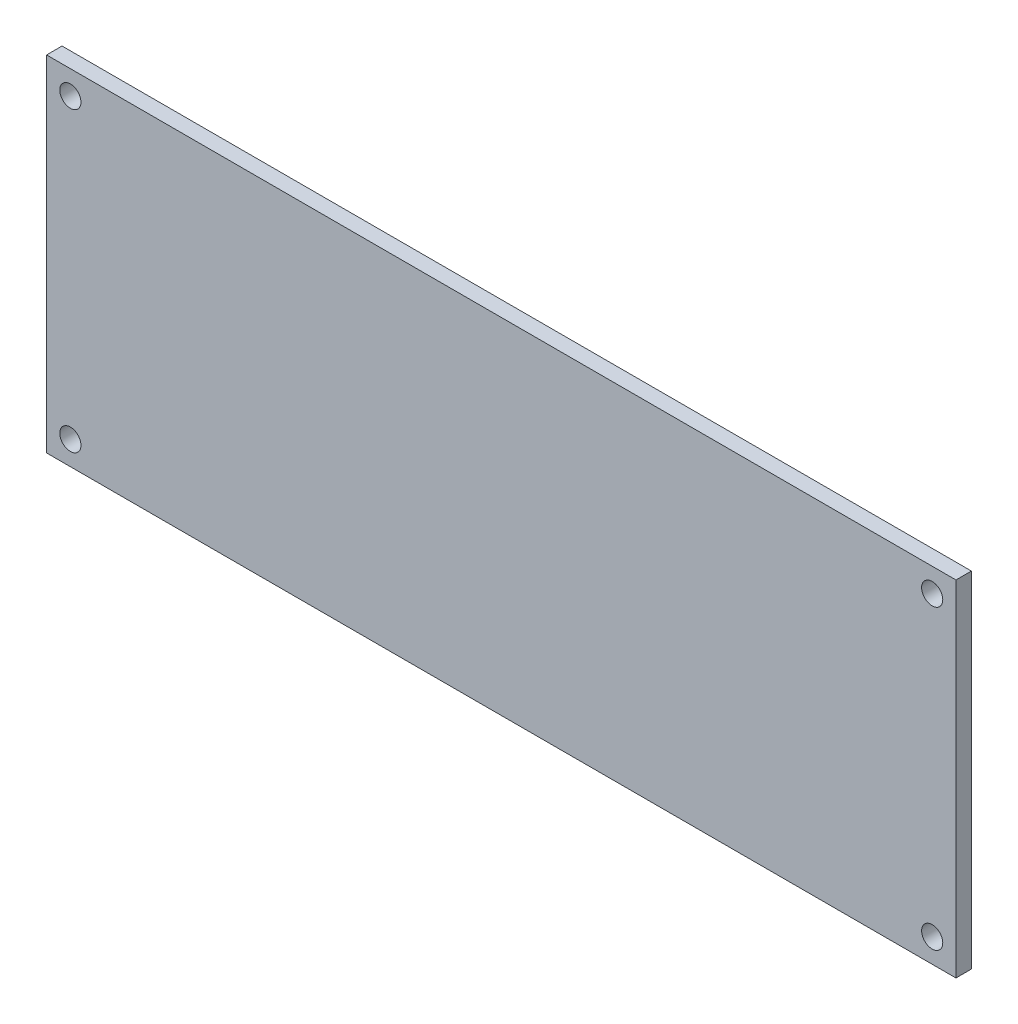
ISO-10303-21;
HEADER;
FILE_DESCRIPTION(('STEP AP214'),'2;1');
FILE_NAME('part.step','',(''),(''),'','','');
FILE_SCHEMA(('AUTOMOTIVE_DESIGN { 1 0 10303 214 1 1 1 1 }'));
ENDSEC;
DATA;
#1=APPLICATION_CONTEXT('core data for automotive mechanical design processes');
#2=APPLICATION_PROTOCOL_DEFINITION('international standard','automotive_design',2000,#1);
#3=PRODUCT_CONTEXT('',#1,'mechanical');
#4=PRODUCT('Part','Part','',(#3));
#5=PRODUCT_RELATED_PRODUCT_CATEGORY('part','',(#4));
#6=PRODUCT_DEFINITION_FORMATION('','',#4);
#7=PRODUCT_DEFINITION_CONTEXT('part definition',#1,'design');
#8=PRODUCT_DEFINITION('design','',#6,#7);
#9=PRODUCT_DEFINITION_SHAPE('','',#8);
#10=(LENGTH_UNIT() NAMED_UNIT(*) SI_UNIT(.MILLI.,.METRE.));
#11=(NAMED_UNIT(*) PLANE_ANGLE_UNIT() SI_UNIT($,.RADIAN.));
#12=(NAMED_UNIT(*) SI_UNIT($,.STERADIAN.) SOLID_ANGLE_UNIT());
#13=UNCERTAINTY_MEASURE_WITH_UNIT(LENGTH_MEASURE(1.E-05),#10,'distance_accuracy_value','');
#14=(GEOMETRIC_REPRESENTATION_CONTEXT(3) GLOBAL_UNCERTAINTY_ASSIGNED_CONTEXT((#13)) GLOBAL_UNIT_ASSIGNED_CONTEXT((#10,
#11,#12)) REPRESENTATION_CONTEXT('',''));
#15=CARTESIAN_POINT('',(0.,0.,0.));
#16=DIRECTION('',(0.,0.,1.));
#17=DIRECTION('',(1.,0.,0.));
#18=AXIS2_PLACEMENT_3D('',#15,#16,#17);
#19=CARTESIAN_POINT('',(48.5775,-18.415,1.651));
#20=DIRECTION('',(-1.,0.,0.));
#21=DIRECTION('',(0.,0.,1.));
#22=AXIS2_PLACEMENT_3D('',#19,#20,#21);
#23=PLANE('',#22);
#24=DIRECTION('',(0.,1.,0.));
#25=VECTOR('',#24,1.);
#26=CARTESIAN_POINT('',(48.5775,-18.415,0.));
#27=LINE('',#26,#25);
#28=CARTESIAN_POINT('',(48.5775,-18.415,0.));
#29=VERTEX_POINT('',#28);
#30=CARTESIAN_POINT('',(48.5775,18.415,0.));
#31=VERTEX_POINT('',#30);
#32=EDGE_CURVE('E99',#29,#31,#27,.T.);
#33=ORIENTED_EDGE('',*,*,#32,.T.);
#34=DIRECTION('',(0.,0.,-1.));
#35=VECTOR('',#34,1.);
#36=CARTESIAN_POINT('',(48.5775,18.415,1.651));
#37=LINE('',#36,#35);
#38=CARTESIAN_POINT('',(48.5775,18.415,1.651));
#39=VERTEX_POINT('',#38);
#40=EDGE_CURVE('E11',#39,#31,#37,.T.);
#41=ORIENTED_EDGE('',*,*,#40,.F.);
#42=DIRECTION('',(0.,1.,0.));
#43=VECTOR('',#42,1.);
#44=CARTESIAN_POINT('',(48.5775,-18.415,1.651));
#45=LINE('',#44,#43);
#46=CARTESIAN_POINT('',(48.5775,-18.415,1.651));
#47=VERTEX_POINT('',#46);
#48=EDGE_CURVE('E86',#47,#39,#45,.T.);
#49=ORIENTED_EDGE('',*,*,#48,.F.);
#50=DIRECTION('',(0.,0.,-1.));
#51=VECTOR('',#50,1.);
#52=CARTESIAN_POINT('',(48.5775,-18.415,1.651));
#53=LINE('',#52,#51);
#54=EDGE_CURVE('E95',#47,#29,#53,.T.);
#55=ORIENTED_EDGE('',*,*,#54,.T.);
#56=EDGE_LOOP('',(#33,#41,#49,#55));
#57=FACE_BOUND('',#56,.T.);
#58=ADVANCED_FACE('F33',(#57),#23,.F.);
#59=CARTESIAN_POINT('',(-48.5775,18.415,1.651));
#60=DIRECTION('',(0.,-1.,0.));
#61=DIRECTION('',(0.,0.,-1.));
#62=AXIS2_PLACEMENT_3D('',#59,#60,#61);
#63=PLANE('',#62);
#64=DIRECTION('',(-1.,0.,0.));
#65=VECTOR('',#64,1.);
#66=CARTESIAN_POINT('',(-48.5775,18.415,0.));
#67=LINE('',#66,#65);
#68=CARTESIAN_POINT('',(-48.5775,18.415,0.));
#69=VERTEX_POINT('',#68);
#70=EDGE_CURVE('E90',#31,#69,#67,.T.);
#71=ORIENTED_EDGE('',*,*,#70,.T.);
#72=DIRECTION('',(0.,0.,-1.));
#73=VECTOR('',#72,1.);
#74=CARTESIAN_POINT('',(-48.5775,18.415,1.651));
#75=LINE('',#74,#73);
#76=CARTESIAN_POINT('',(-48.5775,18.415,1.651));
#77=VERTEX_POINT('',#76);
#78=EDGE_CURVE('E42',#77,#69,#75,.T.);
#79=ORIENTED_EDGE('',*,*,#78,.F.);
#80=DIRECTION('',(-1.,0.,0.));
#81=VECTOR('',#80,1.);
#82=CARTESIAN_POINT('',(-48.5775,18.415,1.651));
#83=LINE('',#82,#81);
#84=EDGE_CURVE('E81',#39,#77,#83,.T.);
#85=ORIENTED_EDGE('',*,*,#84,.F.);
#86=ORIENTED_EDGE('',*,*,#40,.T.);
#87=EDGE_LOOP('',(#71,#79,#85,#86));
#88=FACE_BOUND('',#87,.T.);
#89=ADVANCED_FACE('F89',(#88),#63,.F.);
#90=CARTESIAN_POINT('',(-48.5775,-18.415,1.651));
#91=DIRECTION('',(1.,0.,0.));
#92=DIRECTION('',(0.,0.,-1.));
#93=AXIS2_PLACEMENT_3D('',#90,#91,#92);
#94=PLANE('',#93);
#95=DIRECTION('',(0.,-1.,0.));
#96=VECTOR('',#95,1.);
#97=CARTESIAN_POINT('',(-48.5775,-18.415,0.));
#98=LINE('',#97,#96);
#99=CARTESIAN_POINT('',(-48.5775,-18.415,0.));
#100=VERTEX_POINT('',#99);
#101=EDGE_CURVE('E68',#69,#100,#98,.T.);
#102=ORIENTED_EDGE('',*,*,#101,.T.);
#103=DIRECTION('',(0.,0.,-1.));
#104=VECTOR('',#103,1.);
#105=CARTESIAN_POINT('',(-48.5775,-18.415,1.651));
#106=LINE('',#105,#104);
#107=CARTESIAN_POINT('',(-48.5775,-18.415,1.651));
#108=VERTEX_POINT('',#107);
#109=EDGE_CURVE('E91',#108,#100,#106,.T.);
#110=ORIENTED_EDGE('',*,*,#109,.F.);
#111=DIRECTION('',(0.,-1.,0.));
#112=VECTOR('',#111,1.);
#113=CARTESIAN_POINT('',(-48.5775,-18.415,1.651));
#114=LINE('',#113,#112);
#115=EDGE_CURVE('E84',#77,#108,#114,.T.);
#116=ORIENTED_EDGE('',*,*,#115,.F.);
#117=ORIENTED_EDGE('',*,*,#78,.T.);
#118=EDGE_LOOP('',(#102,#110,#116,#117));
#119=FACE_BOUND('',#118,.T.);
#120=ADVANCED_FACE('F93',(#119),#94,.F.);
#121=CARTESIAN_POINT('',(-48.5775,-18.415,1.651));
#122=DIRECTION('',(0.,1.,0.));
#123=DIRECTION('',(0.,0.,1.));
#124=AXIS2_PLACEMENT_3D('',#121,#122,#123);
#125=PLANE('',#124);
#126=DIRECTION('',(1.,0.,0.));
#127=VECTOR('',#126,1.);
#128=CARTESIAN_POINT('',(-48.5775,-18.415,0.));
#129=LINE('',#128,#127);
#130=EDGE_CURVE('E74',#100,#29,#129,.T.);
#131=ORIENTED_EDGE('',*,*,#130,.T.);
#132=ORIENTED_EDGE('',*,*,#54,.F.);
#133=DIRECTION('',(1.,0.,0.));
#134=VECTOR('',#133,1.);
#135=CARTESIAN_POINT('',(-48.5775,-18.415,1.651));
#136=LINE('',#135,#134);
#137=EDGE_CURVE('E51',#108,#47,#136,.T.);
#138=ORIENTED_EDGE('',*,*,#137,.F.);
#139=ORIENTED_EDGE('',*,*,#109,.T.);
#140=EDGE_LOOP('',(#131,#132,#138,#139));
#141=FACE_BOUND('',#140,.T.);
#142=ADVANCED_FACE('F137',(#141),#125,.F.);
#143=CARTESIAN_POINT('',(0.,0.,1.651));
#144=DIRECTION('',(0.,0.,-1.));
#145=DIRECTION('',(-1.,0.,0.));
#146=AXIS2_PLACEMENT_3D('',#143,#144,#145);
#147=PLANE('',#146);
#148=CARTESIAN_POINT('',(-46.0375,15.875,1.651));
#149=DIRECTION('',(0.,0.,1.));
#150=DIRECTION('',(1.,0.,0.));
#151=AXIS2_PLACEMENT_3D('',#148,#149,#150);
#152=CIRCLE('',#151,1.13029999999999);
#153=CARTESIAN_POINT('',(-44.9072,15.875,1.651));
#154=VERTEX_POINT('',#153);
#155=EDGE_CURVE('E220',#154,#154,#152,.T.);
#156=ORIENTED_EDGE('',*,*,#155,.F.);
#157=EDGE_LOOP('',(#156));
#158=FACE_BOUND('',#157,.T.);
#159=CARTESIAN_POINT('',(-46.0375,-15.875,1.651));
#160=DIRECTION('',(0.,0.,1.));
#161=DIRECTION('',(1.,0.,0.));
#162=AXIS2_PLACEMENT_3D('',#159,#160,#161);
#163=CIRCLE('',#162,1.13029999999999);
#164=CARTESIAN_POINT('',(-44.9072,-15.875,1.651));
#165=VERTEX_POINT('',#164);
#166=EDGE_CURVE('E120',#165,#165,#163,.T.);
#167=ORIENTED_EDGE('',*,*,#166,.F.);
#168=EDGE_LOOP('',(#167));
#169=FACE_BOUND('',#168,.T.);
#170=CARTESIAN_POINT('',(46.0375,-15.875,1.651));
#171=DIRECTION('',(0.,0.,1.));
#172=DIRECTION('',(1.,0.,0.));
#173=AXIS2_PLACEMENT_3D('',#170,#171,#172);
#174=CIRCLE('',#173,1.13029999999999);
#175=CARTESIAN_POINT('',(47.1678,-15.875,1.651));
#176=VERTEX_POINT('',#175);
#177=EDGE_CURVE('E110',#176,#176,#174,.T.);
#178=ORIENTED_EDGE('',*,*,#177,.F.);
#179=EDGE_LOOP('',(#178));
#180=FACE_BOUND('',#179,.T.);
#181=CARTESIAN_POINT('',(46.0375,15.875,1.651));
#182=DIRECTION('',(0.,0.,1.));
#183=DIRECTION('',(1.,0.,0.));
#184=AXIS2_PLACEMENT_3D('',#181,#182,#183);
#185=CIRCLE('',#184,1.13029999999999);
#186=CARTESIAN_POINT('',(47.1678,15.875,1.651));
#187=VERTEX_POINT('',#186);
#188=EDGE_CURVE('E109',#187,#187,#185,.T.);
#189=ORIENTED_EDGE('',*,*,#188,.F.);
#190=EDGE_LOOP('',(#189));
#191=FACE_BOUND('',#190,.T.);
#192=ORIENTED_EDGE('',*,*,#48,.T.);
#193=ORIENTED_EDGE('',*,*,#84,.T.);
#194=ORIENTED_EDGE('',*,*,#115,.T.);
#195=ORIENTED_EDGE('',*,*,#137,.T.);
#196=EDGE_LOOP('',(#192,#193,#194,#195));
#197=FACE_BOUND('',#196,.T.);
#198=ADVANCED_FACE('F82',(#158,#169,#180,#191,#197),#147,.F.);
#199=CARTESIAN_POINT('',(0.,0.,0.));
#200=DIRECTION('',(0.,0.,-1.));
#201=DIRECTION('',(-1.,0.,0.));
#202=AXIS2_PLACEMENT_3D('',#199,#200,#201);
#203=PLANE('',#202);
#204=CARTESIAN_POINT('',(-46.0375,15.875,0.));
#205=DIRECTION('',(0.,0.,-1.));
#206=DIRECTION('',(-1.,0.,0.));
#207=AXIS2_PLACEMENT_3D('',#204,#205,#206);
#208=CIRCLE('',#207,1.13029999999999);
#209=CARTESIAN_POINT('',(-47.1678,15.875,0.));
#210=VERTEX_POINT('',#209);
#211=EDGE_CURVE('E217',#210,#210,#208,.T.);
#212=ORIENTED_EDGE('',*,*,#211,.F.);
#213=EDGE_LOOP('',(#212));
#214=FACE_BOUND('',#213,.T.);
#215=CARTESIAN_POINT('',(-46.0375,-15.875,0.));
#216=DIRECTION('',(0.,0.,-1.));
#217=DIRECTION('',(-1.,0.,0.));
#218=AXIS2_PLACEMENT_3D('',#215,#216,#217);
#219=CIRCLE('',#218,1.13029999999999);
#220=CARTESIAN_POINT('',(-47.1678,-15.875,0.));
#221=VERTEX_POINT('',#220);
#222=EDGE_CURVE('E36',#221,#221,#219,.T.);
#223=ORIENTED_EDGE('',*,*,#222,.F.);
#224=EDGE_LOOP('',(#223));
#225=FACE_BOUND('',#224,.T.);
#226=CARTESIAN_POINT('',(46.0375,-15.875,0.));
#227=DIRECTION('',(0.,0.,-1.));
#228=DIRECTION('',(-1.,0.,0.));
#229=AXIS2_PLACEMENT_3D('',#226,#227,#228);
#230=CIRCLE('',#229,1.13029999999999);
#231=CARTESIAN_POINT('',(44.9072,-15.875,0.));
#232=VERTEX_POINT('',#231);
#233=EDGE_CURVE('E107',#232,#232,#230,.T.);
#234=ORIENTED_EDGE('',*,*,#233,.F.);
#235=EDGE_LOOP('',(#234));
#236=FACE_BOUND('',#235,.T.);
#237=CARTESIAN_POINT('',(46.0375,15.875,0.));
#238=DIRECTION('',(0.,0.,-1.));
#239=DIRECTION('',(-1.,0.,0.));
#240=AXIS2_PLACEMENT_3D('',#237,#238,#239);
#241=CIRCLE('',#240,1.13029999999999);
#242=CARTESIAN_POINT('',(44.9072,15.875,0.));
#243=VERTEX_POINT('',#242);
#244=EDGE_CURVE('E102',#243,#243,#241,.T.);
#245=ORIENTED_EDGE('',*,*,#244,.F.);
#246=EDGE_LOOP('',(#245));
#247=FACE_BOUND('',#246,.T.);
#248=ORIENTED_EDGE('',*,*,#32,.F.);
#249=ORIENTED_EDGE('',*,*,#130,.F.);
#250=ORIENTED_EDGE('',*,*,#101,.F.);
#251=ORIENTED_EDGE('',*,*,#70,.F.);
#252=EDGE_LOOP('',(#248,#249,#250,#251));
#253=FACE_BOUND('',#252,.T.);
#254=ADVANCED_FACE('F130',(#214,#225,#236,#247,#253),#203,.T.);
#255=CARTESIAN_POINT('',(46.0375,15.875,1.651));
#256=DIRECTION('',(0.,0.,1.));
#257=DIRECTION('',(1.,0.,0.));
#258=AXIS2_PLACEMENT_3D('',#255,#256,#257);
#259=CYLINDRICAL_SURFACE('',#258,1.13029999999999);
#260=ORIENTED_EDGE('',*,*,#244,.T.);
#261=EDGE_LOOP('',(#260));
#262=FACE_BOUND('',#261,.T.);
#263=ORIENTED_EDGE('',*,*,#188,.T.);
#264=EDGE_LOOP('',(#263));
#265=FACE_BOUND('',#264,.T.);
#266=ADVANCED_FACE('F127',(#262,#265),#259,.F.);
#267=CARTESIAN_POINT('',(46.0375,-15.875,1.651));
#268=DIRECTION('',(0.,0.,1.));
#269=DIRECTION('',(1.,0.,0.));
#270=AXIS2_PLACEMENT_3D('',#267,#268,#269);
#271=CYLINDRICAL_SURFACE('',#270,1.13029999999999);
#272=ORIENTED_EDGE('',*,*,#233,.T.);
#273=EDGE_LOOP('',(#272));
#274=FACE_BOUND('',#273,.T.);
#275=ORIENTED_EDGE('',*,*,#177,.T.);
#276=EDGE_LOOP('',(#275));
#277=FACE_BOUND('',#276,.T.);
#278=ADVANCED_FACE('F182',(#274,#277),#271,.F.);
#279=CARTESIAN_POINT('',(-46.0375,-15.875,1.651));
#280=DIRECTION('',(0.,0.,1.));
#281=DIRECTION('',(1.,0.,0.));
#282=AXIS2_PLACEMENT_3D('',#279,#280,#281);
#283=CYLINDRICAL_SURFACE('',#282,1.13029999999999);
#284=ORIENTED_EDGE('',*,*,#222,.T.);
#285=EDGE_LOOP('',(#284));
#286=FACE_BOUND('',#285,.T.);
#287=ORIENTED_EDGE('',*,*,#166,.T.);
#288=EDGE_LOOP('',(#287));
#289=FACE_BOUND('',#288,.T.);
#290=ADVANCED_FACE('F191',(#286,#289),#283,.F.);
#291=CARTESIAN_POINT('',(-46.0375,15.875,1.651));
#292=DIRECTION('',(0.,0.,1.));
#293=DIRECTION('',(1.,0.,0.));
#294=AXIS2_PLACEMENT_3D('',#291,#292,#293);
#295=CYLINDRICAL_SURFACE('',#294,1.13029999999999);
#296=ORIENTED_EDGE('',*,*,#211,.T.);
#297=EDGE_LOOP('',(#296));
#298=FACE_BOUND('',#297,.T.);
#299=ORIENTED_EDGE('',*,*,#155,.T.);
#300=EDGE_LOOP('',(#299));
#301=FACE_BOUND('',#300,.T.);
#302=ADVANCED_FACE('F200',(#298,#301),#295,.F.);
#303=CLOSED_SHELL('',(#58,#89,#120,#142,#198,#254,#266,#278,#290,#302));
#304=MANIFOLD_SOLID_BREP('B2',#303);
#305=ADVANCED_BREP_SHAPE_REPRESENTATION('',(#18,#304),#14);
#306=SHAPE_DEFINITION_REPRESENTATION(#9,#305);
ENDSEC;
END-ISO-10303-21;
